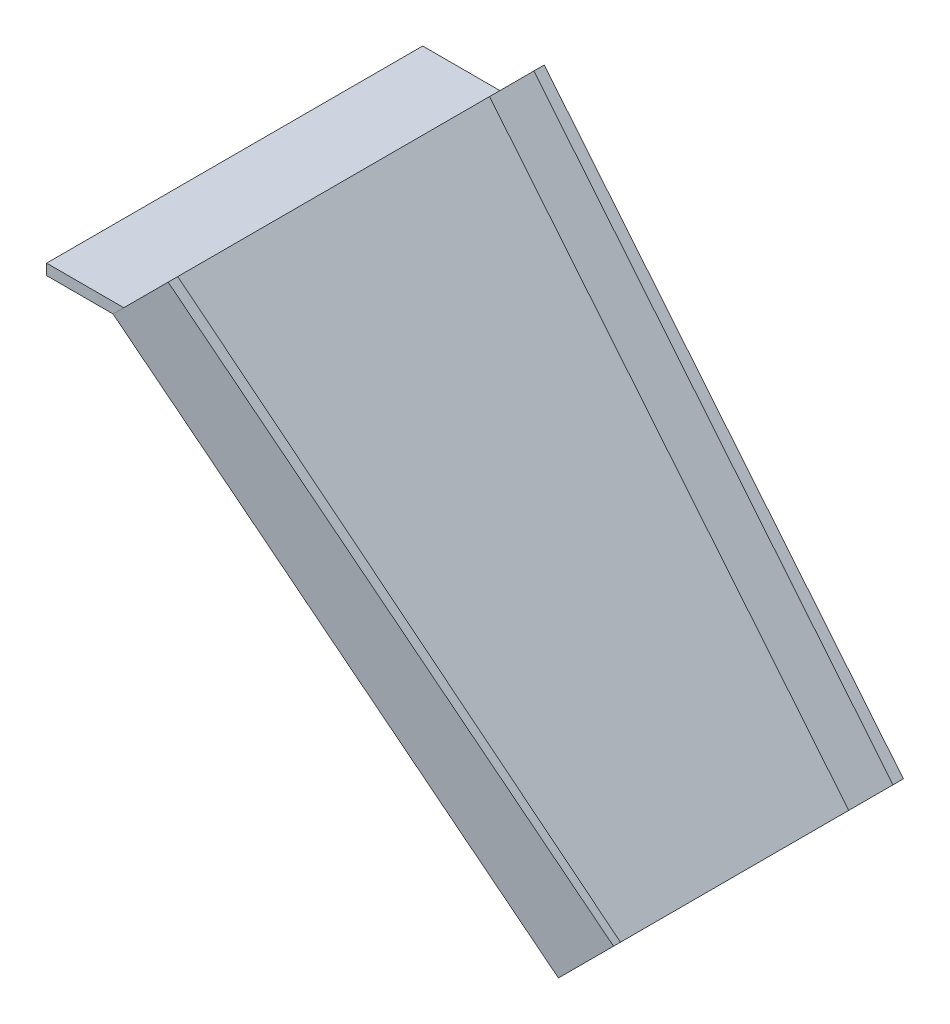
ISO-10303-21;
HEADER;
FILE_DESCRIPTION(('STEP AP214'),'2;1');
FILE_NAME('part.step','',(''),(''),'','','');
FILE_SCHEMA(('AUTOMOTIVE_DESIGN { 1 0 10303 214 1 1 1 1 }'));
ENDSEC;
DATA;
#1=APPLICATION_CONTEXT('core data for automotive mechanical design processes');
#2=APPLICATION_PROTOCOL_DEFINITION('international standard','automotive_design',2000,#1);
#3=PRODUCT_CONTEXT('',#1,'mechanical');
#4=PRODUCT('Part','Part','',(#3));
#5=PRODUCT_RELATED_PRODUCT_CATEGORY('part','',(#4));
#6=PRODUCT_DEFINITION_FORMATION('','',#4);
#7=PRODUCT_DEFINITION_CONTEXT('part definition',#1,'design');
#8=PRODUCT_DEFINITION('design','',#6,#7);
#9=PRODUCT_DEFINITION_SHAPE('','',#8);
#10=(LENGTH_UNIT() NAMED_UNIT(*) SI_UNIT(.MILLI.,.METRE.));
#11=(NAMED_UNIT(*) PLANE_ANGLE_UNIT() SI_UNIT($,.RADIAN.));
#12=(NAMED_UNIT(*) SI_UNIT($,.STERADIAN.) SOLID_ANGLE_UNIT());
#13=UNCERTAINTY_MEASURE_WITH_UNIT(LENGTH_MEASURE(1.E-05),#10,'distance_accuracy_value','');
#14=(GEOMETRIC_REPRESENTATION_CONTEXT(3) GLOBAL_UNCERTAINTY_ASSIGNED_CONTEXT((#13)) GLOBAL_UNIT_ASSIGNED_CONTEXT((#10,
#11,#12)) REPRESENTATION_CONTEXT('',''));
#15=CARTESIAN_POINT('',(0.,0.,0.));
#16=DIRECTION('',(0.,0.,1.));
#17=DIRECTION('',(1.,0.,0.));
#18=AXIS2_PLACEMENT_3D('',#15,#16,#17);
#19=CARTESIAN_POINT('',(-31.819805153395,31.8198051533942,60.));
#20=DIRECTION('',(-0.707106781186539,-0.707106781186556,0.));
#21=DIRECTION('',(0.707106781186556,-0.707106781186539,0.));
#22=AXIS2_PLACEMENT_3D('',#19,#20,#21);
#23=PLANE('',#22);
#24=DIRECTION('',(0.705359956821406,-0.705359956821389,0.0702471538628643));
#25=VECTOR('',#24,1.);
#26=CARTESIAN_POINT('',(-0.238955902753282,0.238955902753279,4.79876880356784));
#27=LINE('',#26,#25);
#28=CARTESIAN_POINT('',(-31.819805153395,31.8198051533942,1.65361609823578));
#29=VERTEX_POINT('',#28);
#30=CARTESIAN_POINT('',(31.819805153395,-31.8198051533943,7.9915169866551));
#31=VERTEX_POINT('',#30);
#32=EDGE_CURVE('E57',#29,#31,#27,.T.);
#33=ORIENTED_EDGE('',*,*,#32,.F.);
#34=DIRECTION('',(0.,0.,-1.));
#35=VECTOR('',#34,1.);
#36=CARTESIAN_POINT('',(-31.819805153395,31.8198051533942,60.));
#37=LINE('',#36,#35);
#38=CARTESIAN_POINT('',(-31.819805153395,31.8198051533942,58.4672147740546));
#39=VERTEX_POINT('',#38);
#40=EDGE_CURVE('E210',#39,#29,#37,.T.);
#41=ORIENTED_EDGE('',*,*,#40,.F.);
#42=DIRECTION('',(-0.704981227792333,0.704981227792316,0.0774786223474125));
#43=VECTOR('',#42,1.);
#44=CARTESIAN_POINT('',(-31.819805153395,31.8198051533942,58.4672147740546));
#45=LINE('',#44,#43);
#46=CARTESIAN_POINT('',(31.819805153395,-31.8198051533942,51.473114592498));
#47=VERTEX_POINT('',#46);
#48=EDGE_CURVE('E63',#47,#39,#45,.T.);
#49=ORIENTED_EDGE('',*,*,#48,.F.);
#50=DIRECTION('',(0.,0.,-1.));
#51=VECTOR('',#50,1.);
#52=CARTESIAN_POINT('',(31.819805153395,-31.8198051533942,60.));
#53=LINE('',#52,#51);
#54=EDGE_CURVE('E209',#47,#31,#53,.T.);
#55=ORIENTED_EDGE('',*,*,#54,.T.);
#56=EDGE_LOOP('',(#33,#41,#49,#55));
#57=FACE_BOUND('',#56,.T.);
#58=ADVANCED_FACE('F41',(#57),#23,.F.);
#59=CARTESIAN_POINT('',(30.0977672761382,-33.5418430306511,60.));
#60=DIRECTION('',(-0.707106781186555,0.70710678118654,0.));
#61=DIRECTION('',(-0.70710678118654,-0.707106781186555,0.));
#62=AXIS2_PLACEMENT_3D('',#59,#60,#61);
#63=PLANE('',#62);
#64=DIRECTION('',(0.707106781186539,0.707106781186556,0.));
#65=VECTOR('',#64,1.);
#66=CARTESIAN_POINT('',(-7.01971698641241,-70.6593272932026,6.33790088841932));
#67=LINE('',#66,#65);
#68=CARTESIAN_POINT('',(30.0977672761383,-33.5418430306511,6.33790088841932));
#69=VERTEX_POINT('',#68);
#70=CARTESIAN_POINT('',(38.8908729652604,-24.7487373415287,6.33790088841933));
#71=VERTEX_POINT('',#70);
#72=EDGE_CURVE('E174',#69,#71,#67,.T.);
#73=ORIENTED_EDGE('',*,*,#72,.T.);
#74=DIRECTION('',(0.,0.,-1.));
#75=VECTOR('',#74,1.);
#76=CARTESIAN_POINT('',(38.8908729652604,-24.7487373415287,0.));
#77=LINE('',#76,#75);
#78=CARTESIAN_POINT('',(38.8908729652604,-24.7487373415287,7.9915169866551));
#79=VERTEX_POINT('',#78);
#80=EDGE_CURVE('E131',#79,#71,#77,.T.);
#81=ORIENTED_EDGE('',*,*,#80,.F.);
#82=DIRECTION('',(-0.707106781186539,-0.707106781186556,0.));
#83=VECTOR('',#82,1.);
#84=CARTESIAN_POINT('',(38.8908729652604,-24.7487373415287,7.9915169866551));
#85=LINE('',#84,#83);
#86=EDGE_CURVE('E133',#79,#31,#85,.T.);
#87=ORIENTED_EDGE('',*,*,#86,.T.);
#88=ORIENTED_EDGE('',*,*,#54,.F.);
#89=DIRECTION('',(-0.707106781186539,-0.707106781186556,0.));
#90=VECTOR('',#89,1.);
#91=CARTESIAN_POINT('',(38.8908729652604,-24.7487373415287,51.473114592498));
#92=LINE('',#91,#90);
#93=CARTESIAN_POINT('',(38.8908729652604,-24.7487373415287,51.473114592498));
#94=VERTEX_POINT('',#93);
#95=EDGE_CURVE('E166',#94,#47,#92,.T.);
#96=ORIENTED_EDGE('',*,*,#95,.F.);
#97=DIRECTION('',(0.,0.,-1.));
#98=VECTOR('',#97,1.);
#99=CARTESIAN_POINT('',(38.8908729652604,-24.7487373415287,51.473114592498));
#100=LINE('',#99,#98);
#101=CARTESIAN_POINT('',(38.8908729652604,-24.7487373415287,52.5774462001122));
#102=VERTEX_POINT('',#101);
#103=EDGE_CURVE('E160',#102,#94,#100,.T.);
#104=ORIENTED_EDGE('',*,*,#103,.F.);
#105=DIRECTION('',(0.707106781186539,0.707106781186556,0.));
#106=VECTOR('',#105,1.);
#107=CARTESIAN_POINT('',(-7.01971698641241,-70.6593272932026,52.5774462001122));
#108=LINE('',#107,#106);
#109=CARTESIAN_POINT('',(30.0977672761382,-33.5418430306511,52.5774462001122));
#110=VERTEX_POINT('',#109);
#111=EDGE_CURVE('E180',#110,#102,#108,.T.);
#112=ORIENTED_EDGE('',*,*,#111,.F.);
#113=DIRECTION('',(0.,0.,-1.));
#114=VECTOR('',#113,1.);
#115=CARTESIAN_POINT('',(30.0977672761382,-33.5418430306511,60.));
#116=LINE('',#115,#114);
#117=EDGE_CURVE('E186',#110,#69,#116,.T.);
#118=ORIENTED_EDGE('',*,*,#117,.T.);
#119=EDGE_LOOP('',(#73,#81,#87,#88,#96,#104,#112,#118));
#120=FACE_BOUND('',#119,.T.);
#121=ADVANCED_FACE('F43',(#120),#63,.F.);
#122=CARTESIAN_POINT('',(0.,0.,0.));
#123=DIRECTION('',(0.,0.,-1.));
#124=DIRECTION('',(-1.,0.,0.));
#125=AXIS2_PLACEMENT_3D('',#122,#123,#124);
#126=PLANE('',#125);
#127=DIRECTION('',(-1.,0.,0.));
#128=VECTOR('',#127,1.);
#129=CARTESIAN_POINT('',(-31.819805153395,31.8198051533942,0.));
#130=LINE('',#129,#128);
#131=CARTESIAN_POINT('',(-31.8198051533946,31.8198051533946,0.));
#132=VERTEX_POINT('',#131);
#133=CARTESIAN_POINT('',(-44.1372012489649,31.8198051533946,0.));
#134=VERTEX_POINT('',#133);
#135=EDGE_CURVE('E182',#132,#134,#130,.T.);
#136=ORIENTED_EDGE('',*,*,#135,.F.);
#137=DIRECTION('',(-0.707106781186539,-0.707106781186556,0.));
#138=VECTOR('',#137,1.);
#139=CARTESIAN_POINT('',(-31.819805153395,31.8198051533942,0.));
#140=LINE('',#139,#138);
#141=CARTESIAN_POINT('',(-33.541843030651,30.0977672761382,0.));
#142=VERTEX_POINT('',#141);
#143=EDGE_CURVE('E11',#132,#142,#140,.T.);
#144=ORIENTED_EDGE('',*,*,#143,.T.);
#145=DIRECTION('',(1.,0.,0.));
#146=VECTOR('',#145,1.);
#147=CARTESIAN_POINT('',(-44.1372012489649,30.0977672761382,0.));
#148=LINE('',#147,#146);
#149=CARTESIAN_POINT('',(-44.1372012489649,30.0977672761382,0.));
#150=VERTEX_POINT('',#149);
#151=EDGE_CURVE('E183',#150,#142,#148,.T.);
#152=ORIENTED_EDGE('',*,*,#151,.F.);
#153=DIRECTION('',(0.,-1.,0.));
#154=VECTOR('',#153,1.);
#155=CARTESIAN_POINT('',(-44.1372012489649,31.8198051533946,0.));
#156=LINE('',#155,#154);
#157=EDGE_CURVE('E195',#134,#150,#156,.T.);
#158=ORIENTED_EDGE('',*,*,#157,.F.);
#159=EDGE_LOOP('',(#136,#144,#152,#158));
#160=FACE_BOUND('',#159,.T.);
#161=ADVANCED_FACE('F233',(#160),#126,.T.);
#162=CARTESIAN_POINT('',(-33.541843030651,30.0977672761382,60.));
#163=DIRECTION('',(0.707106781186547,0.707106781186547,0.));
#164=DIRECTION('',(-0.707106781186548,0.707106781186548,0.));
#165=AXIS2_PLACEMENT_3D('',#162,#163,#164);
#166=PLANE('',#165);
#167=DIRECTION('',(0.,0.,-1.));
#168=VECTOR('',#167,1.);
#169=CARTESIAN_POINT('',(-33.541843030651,30.0977672761382,60.));
#170=LINE('',#169,#168);
#171=CARTESIAN_POINT('',(-33.541843030651,30.0977672761382,60.));
#172=VERTEX_POINT('',#171);
#173=EDGE_CURVE('E196',#172,#142,#170,.T.);
#174=ORIENTED_EDGE('',*,*,#173,.T.);
#175=DIRECTION('',(0.705359956821397,-0.705359956821397,0.0702471538628643));
#176=VECTOR('',#175,1.);
#177=CARTESIAN_POINT('',(-30.5688712657189,27.124795511206,0.296079757549979));
#178=LINE('',#177,#176);
#179=EDGE_CURVE('E175',#142,#69,#178,.T.);
#180=ORIENTED_EDGE('',*,*,#179,.T.);
#181=ORIENTED_EDGE('',*,*,#117,.F.);
#182=DIRECTION('',(0.704714192219636,-0.704714192219636,-0.0821937623451579));
#183=VECTOR('',#182,1.);
#184=CARTESIAN_POINT('',(-33.541843030651,30.0977672761382,60.));
#185=LINE('',#184,#183);
#186=EDGE_CURVE('E177',#172,#110,#185,.T.);
#187=ORIENTED_EDGE('',*,*,#186,.F.);
#188=EDGE_LOOP('',(#174,#180,#181,#187));
#189=FACE_BOUND('',#188,.T.);
#190=ADVANCED_FACE('F222',(#189),#166,.F.);
#191=CARTESIAN_POINT('',(0.,0.,60.));
#192=DIRECTION('',(0.,0.,-1.));
#193=DIRECTION('',(-1.,0.,0.));
#194=AXIS2_PLACEMENT_3D('',#191,#192,#193);
#195=PLANE('',#194);
#196=DIRECTION('',(-0.707106781186539,-0.707106781186556,0.));
#197=VECTOR('',#196,1.);
#198=CARTESIAN_POINT('',(-31.819805153395,31.8198051533942,60.));
#199=LINE('',#198,#197);
#200=CARTESIAN_POINT('',(-31.819805153395,31.8198051533942,60.));
#201=VERTEX_POINT('',#200);
#202=EDGE_CURVE('E47',#201,#172,#199,.T.);
#203=ORIENTED_EDGE('',*,*,#202,.F.);
#204=DIRECTION('',(-1.,0.,0.));
#205=VECTOR('',#204,1.);
#206=CARTESIAN_POINT('',(-31.819805153395,31.8198051533942,60.));
#207=LINE('',#206,#205);
#208=CARTESIAN_POINT('',(-44.1372012489649,31.8198051533946,60.));
#209=VERTEX_POINT('',#208);
#210=EDGE_CURVE('E185',#201,#209,#207,.T.);
#211=ORIENTED_EDGE('',*,*,#210,.T.);
#212=DIRECTION('',(0.,-1.,0.));
#213=VECTOR('',#212,1.);
#214=CARTESIAN_POINT('',(-44.1372012489649,31.8198051533946,60.));
#215=LINE('',#214,#213);
#216=CARTESIAN_POINT('',(-44.1372012489649,30.0977672761382,60.));
#217=VERTEX_POINT('',#216);
#218=EDGE_CURVE('E184',#209,#217,#215,.T.);
#219=ORIENTED_EDGE('',*,*,#218,.T.);
#220=DIRECTION('',(1.,0.,0.));
#221=VECTOR('',#220,1.);
#222=CARTESIAN_POINT('',(-44.1372012489649,30.0977672761382,60.));
#223=LINE('',#222,#221);
#224=EDGE_CURVE('E189',#217,#172,#223,.T.);
#225=ORIENTED_EDGE('',*,*,#224,.T.);
#226=EDGE_LOOP('',(#203,#211,#219,#225));
#227=FACE_BOUND('',#226,.T.);
#228=ADVANCED_FACE('F221',(#227),#195,.F.);
#229=CARTESIAN_POINT('',(-31.819805153395,31.8198051533942,60.));
#230=DIRECTION('',(0.,-1.,0.));
#231=DIRECTION('',(1.,0.,0.));
#232=AXIS2_PLACEMENT_3D('',#229,#230,#231);
#233=PLANE('',#232);
#234=ORIENTED_EDGE('',*,*,#135,.T.);
#235=DIRECTION('',(0.,0.,-1.));
#236=VECTOR('',#235,1.);
#237=CARTESIAN_POINT('',(-44.1372012489649,31.8198051533946,60.));
#238=LINE('',#237,#236);
#239=EDGE_CURVE('E204',#209,#134,#238,.T.);
#240=ORIENTED_EDGE('',*,*,#239,.F.);
#241=ORIENTED_EDGE('',*,*,#210,.F.);
#242=EDGE_CURVE('E208',#201,#39,#37,.T.);
#243=ORIENTED_EDGE('',*,*,#242,.T.);
#244=ORIENTED_EDGE('',*,*,#40,.T.);
#245=DIRECTION('',(0.,0.,1.));
#246=VECTOR('',#245,1.);
#247=CARTESIAN_POINT('',(-31.819805153395,31.8198051533942,0.));
#248=LINE('',#247,#246);
#249=EDGE_CURVE('E150',#132,#29,#248,.T.);
#250=ORIENTED_EDGE('',*,*,#249,.F.);
#251=EDGE_LOOP('',(#234,#240,#241,#243,#244,#250));
#252=FACE_BOUND('',#251,.T.);
#253=ADVANCED_FACE('F247',(#252),#233,.F.);
#254=CARTESIAN_POINT('',(-44.1372012489649,31.8198051533946,60.));
#255=DIRECTION('',(1.,0.,0.));
#256=DIRECTION('',(0.,0.,-1.));
#257=AXIS2_PLACEMENT_3D('',#254,#255,#256);
#258=PLANE('',#257);
#259=ORIENTED_EDGE('',*,*,#157,.T.);
#260=DIRECTION('',(0.,0.,-1.));
#261=VECTOR('',#260,1.);
#262=CARTESIAN_POINT('',(-44.1372012489649,30.0977672761382,60.));
#263=LINE('',#262,#261);
#264=EDGE_CURVE('E203',#217,#150,#263,.T.);
#265=ORIENTED_EDGE('',*,*,#264,.F.);
#266=ORIENTED_EDGE('',*,*,#218,.F.);
#267=ORIENTED_EDGE('',*,*,#239,.T.);
#268=EDGE_LOOP('',(#259,#265,#266,#267));
#269=FACE_BOUND('',#268,.T.);
#270=ADVANCED_FACE('F273',(#269),#258,.F.);
#271=CARTESIAN_POINT('',(-44.1372012489649,30.0977672761382,60.));
#272=DIRECTION('',(0.,1.,0.));
#273=DIRECTION('',(0.,0.,1.));
#274=AXIS2_PLACEMENT_3D('',#271,#272,#273);
#275=PLANE('',#274);
#276=ORIENTED_EDGE('',*,*,#151,.T.);
#277=ORIENTED_EDGE('',*,*,#173,.F.);
#278=ORIENTED_EDGE('',*,*,#224,.F.);
#279=ORIENTED_EDGE('',*,*,#264,.T.);
#280=EDGE_LOOP('',(#276,#277,#278,#279));
#281=FACE_BOUND('',#280,.T.);
#282=ADVANCED_FACE('F227',(#281),#275,.F.);
#283=CARTESIAN_POINT('',(-70.6593272932025,-7.01971698641413,60.));
#284=DIRECTION('',(0.0581197667254973,-0.0581197667254959,0.996616368233809));
#285=DIRECTION('',(0.998303883486749,0.,-0.0582181777048598));
#286=AXIS2_PLACEMENT_3D('',#283,#284,#285);
#287=PLANE('',#286);
#288=ORIENTED_EDGE('',*,*,#111,.T.);
#289=DIRECTION('',(0.704714192219644,-0.704714192219627,-0.0821937623451578));
#290=VECTOR('',#289,1.);
#291=CARTESIAN_POINT('',(-24.7487373415296,38.8908729652598,60.));
#292=LINE('',#291,#290);
#293=CARTESIAN_POINT('',(-24.7487373415296,38.8908729652598,60.));
#294=VERTEX_POINT('',#293);
#295=EDGE_CURVE('E149',#294,#102,#292,.T.);
#296=ORIENTED_EDGE('',*,*,#295,.F.);
#297=DIRECTION('',(-0.707106781186539,-0.707106781186556,0.));
#298=VECTOR('',#297,1.);
#299=CARTESIAN_POINT('',(-24.7487373415296,38.8908729652598,60.));
#300=LINE('',#299,#298);
#301=EDGE_CURVE('E165',#294,#201,#300,.T.);
#302=ORIENTED_EDGE('',*,*,#301,.T.);
#303=ORIENTED_EDGE('',*,*,#202,.T.);
#304=ORIENTED_EDGE('',*,*,#186,.T.);
#305=EDGE_LOOP('',(#288,#296,#302,#303,#304));
#306=FACE_BOUND('',#305,.T.);
#307=ADVANCED_FACE('F213',(#306),#287,.T.);
#308=CARTESIAN_POINT('',(-70.6593272932025,-7.01971698641413,0.));
#309=DIRECTION('',(-0.0496722388554867,0.0496722388554855,0.997529617291721));
#310=DIRECTION('',(0.998762517271094,0.,0.049733631420879));
#311=AXIS2_PLACEMENT_3D('',#308,#309,#310);
#312=PLANE('',#311);
#313=ORIENTED_EDGE('',*,*,#72,.F.);
#314=ORIENTED_EDGE('',*,*,#179,.F.);
#315=ORIENTED_EDGE('',*,*,#143,.F.);
#316=DIRECTION('',(-0.707106781186539,-0.707106781186556,0.));
#317=VECTOR('',#316,1.);
#318=CARTESIAN_POINT('',(-24.7487373415296,38.8908729652598,0.));
#319=LINE('',#318,#317);
#320=CARTESIAN_POINT('',(-24.7487373415296,38.8908729652598,0.));
#321=VERTEX_POINT('',#320);
#322=EDGE_CURVE('E151',#321,#132,#319,.T.);
#323=ORIENTED_EDGE('',*,*,#322,.F.);
#324=DIRECTION('',(-0.705359956821406,0.705359956821389,-0.0702471538628643));
#325=VECTOR('',#324,1.);
#326=CARTESIAN_POINT('',(6.91404780861365,7.2280878151173,3.1533127428895));
#327=LINE('',#326,#325);
#328=EDGE_CURVE('E143',#71,#321,#327,.T.);
#329=ORIENTED_EDGE('',*,*,#328,.F.);
#330=EDGE_LOOP('',(#313,#314,#315,#323,#329));
#331=FACE_BOUND('',#330,.T.);
#332=ADVANCED_FACE('F237',(#331),#312,.F.);
#333=CARTESIAN_POINT('',(-24.7487373415296,38.8908729652598,58.4672147740546));
#334=DIRECTION('',(0.0547856592588476,-0.0547856592588463,0.996994013562342));
#335=DIRECTION('',(0.9984936132022,0.,-0.0548680635198325));
#336=AXIS2_PLACEMENT_3D('',#333,#334,#335);
#337=PLANE('',#336);
#338=ORIENTED_EDGE('',*,*,#48,.T.);
#339=DIRECTION('',(-0.707106781186539,-0.707106781186556,0.));
#340=VECTOR('',#339,1.);
#341=CARTESIAN_POINT('',(-24.7487373415296,38.8908729652598,58.4672147740546));
#342=LINE('',#341,#340);
#343=CARTESIAN_POINT('',(-24.7487373415296,38.8908729652598,58.4672147740546));
#344=VERTEX_POINT('',#343);
#345=EDGE_CURVE('E167',#344,#39,#342,.T.);
#346=ORIENTED_EDGE('',*,*,#345,.F.);
#347=DIRECTION('',(-0.704981227792333,0.704981227792316,0.0774786223474125));
#348=VECTOR('',#347,1.);
#349=CARTESIAN_POINT('',(-24.7487373415296,38.8908729652598,58.4672147740546));
#350=LINE('',#349,#348);
#351=EDGE_CURVE('E157',#94,#344,#350,.T.);
#352=ORIENTED_EDGE('',*,*,#351,.F.);
#353=ORIENTED_EDGE('',*,*,#95,.T.);
#354=EDGE_LOOP('',(#338,#346,#352,#353));
#355=FACE_BOUND('',#354,.T.);
#356=ADVANCED_FACE('F252',(#355),#337,.F.);
#357=CARTESIAN_POINT('',(-24.7487373415296,38.8908729652598,60.));
#358=DIRECTION('',(0.707106781186556,-0.707106781186539,0.));
#359=DIRECTION('',(0.707106781186539,0.707106781186556,0.));
#360=AXIS2_PLACEMENT_3D('',#357,#358,#359);
#361=PLANE('',#360);
#362=ORIENTED_EDGE('',*,*,#242,.F.);
#363=ORIENTED_EDGE('',*,*,#301,.F.);
#364=DIRECTION('',(0.,0.,1.));
#365=VECTOR('',#364,1.);
#366=CARTESIAN_POINT('',(-24.7487373415296,38.8908729652598,60.));
#367=LINE('',#366,#365);
#368=EDGE_CURVE('E161',#344,#294,#367,.T.);
#369=ORIENTED_EDGE('',*,*,#368,.F.);
#370=ORIENTED_EDGE('',*,*,#345,.T.);
#371=EDGE_LOOP('',(#362,#363,#369,#370));
#372=FACE_BOUND('',#371,.T.);
#373=ADVANCED_FACE('F250',(#372),#361,.F.);
#374=CARTESIAN_POINT('',(7.07106781186539,7.07106781186556,0.));
#375=DIRECTION('',(-0.707106781186539,-0.707106781186556,0.));
#376=DIRECTION('',(0.707106781186556,-0.707106781186539,0.));
#377=AXIS2_PLACEMENT_3D('',#374,#375,#376);
#378=PLANE('',#377);
#379=ORIENTED_EDGE('',*,*,#295,.T.);
#380=ORIENTED_EDGE('',*,*,#103,.T.);
#381=ORIENTED_EDGE('',*,*,#351,.T.);
#382=ORIENTED_EDGE('',*,*,#368,.T.);
#383=EDGE_LOOP('',(#379,#380,#381,#382));
#384=FACE_BOUND('',#383,.T.);
#385=ADVANCED_FACE('F243',(#384),#378,.F.);
#386=CARTESIAN_POINT('',(-24.7487373415296,38.8908729652598,0.));
#387=DIRECTION('',(0.707106781186556,-0.707106781186539,0.));
#388=DIRECTION('',(0.707106781186539,0.707106781186556,0.));
#389=AXIS2_PLACEMENT_3D('',#386,#387,#388);
#390=PLANE('',#389);
#391=ORIENTED_EDGE('',*,*,#249,.T.);
#392=DIRECTION('',(-0.707106781186539,-0.707106781186556,0.));
#393=VECTOR('',#392,1.);
#394=CARTESIAN_POINT('',(-24.7487373415296,38.8908729652598,1.65361609823578));
#395=LINE('',#394,#393);
#396=CARTESIAN_POINT('',(-24.7487373415296,38.8908729652598,1.65361609823578));
#397=VERTEX_POINT('',#396);
#398=EDGE_CURVE('E126',#397,#29,#395,.T.);
#399=ORIENTED_EDGE('',*,*,#398,.F.);
#400=DIRECTION('',(0.,0.,1.));
#401=VECTOR('',#400,1.);
#402=CARTESIAN_POINT('',(-24.7487373415296,38.8908729652598,0.));
#403=LINE('',#402,#401);
#404=EDGE_CURVE('E136',#321,#397,#403,.T.);
#405=ORIENTED_EDGE('',*,*,#404,.F.);
#406=ORIENTED_EDGE('',*,*,#322,.T.);
#407=EDGE_LOOP('',(#391,#399,#405,#406));
#408=FACE_BOUND('',#407,.T.);
#409=ADVANCED_FACE('F148',(#408),#390,.F.);
#410=CARTESIAN_POINT('',(6.83211190911211,7.31002371461884,4.79876880356784));
#411=DIRECTION('',(0.0496722388554867,-0.0496722388554855,-0.997529617291721));
#412=DIRECTION('',(-0.998762517271094,0.,-0.049733631420879));
#413=AXIS2_PLACEMENT_3D('',#410,#411,#412);
#414=PLANE('',#413);
#415=ORIENTED_EDGE('',*,*,#32,.T.);
#416=ORIENTED_EDGE('',*,*,#86,.F.);
#417=DIRECTION('',(0.705359956821406,-0.705359956821389,0.0702471538628643));
#418=VECTOR('',#417,1.);
#419=CARTESIAN_POINT('',(6.83211190911211,7.31002371461884,4.79876880356784));
#420=LINE('',#419,#418);
#421=EDGE_CURVE('E122',#397,#79,#420,.T.);
#422=ORIENTED_EDGE('',*,*,#421,.F.);
#423=ORIENTED_EDGE('',*,*,#398,.T.);
#424=EDGE_LOOP('',(#415,#416,#422,#423));
#425=FACE_BOUND('',#424,.T.);
#426=ADVANCED_FACE('F127',(#425),#414,.F.);
#427=CARTESIAN_POINT('',(7.07106781186539,7.07106781186556,0.));
#428=DIRECTION('',(0.707106781186539,0.707106781186556,0.));
#429=DIRECTION('',(-0.707106781186556,0.707106781186539,0.));
#430=AXIS2_PLACEMENT_3D('',#427,#428,#429);
#431=PLANE('',#430);
#432=ORIENTED_EDGE('',*,*,#404,.T.);
#433=ORIENTED_EDGE('',*,*,#421,.T.);
#434=ORIENTED_EDGE('',*,*,#80,.T.);
#435=ORIENTED_EDGE('',*,*,#328,.T.);
#436=EDGE_LOOP('',(#432,#433,#434,#435));
#437=FACE_BOUND('',#436,.T.);
#438=ADVANCED_FACE('F137',(#437),#431,.T.);
#439=CLOSED_SHELL('',(#58,#121,#161,#190,#228,#253,#270,#282,#307,#332,#356,#373,#385,#409,#426,#438));
#440=MANIFOLD_SOLID_BREP('B2',#439);
#441=ADVANCED_BREP_SHAPE_REPRESENTATION('',(#18,#440),#14);
#442=SHAPE_DEFINITION_REPRESENTATION(#9,#441);
ENDSEC;
END-ISO-10303-21;
